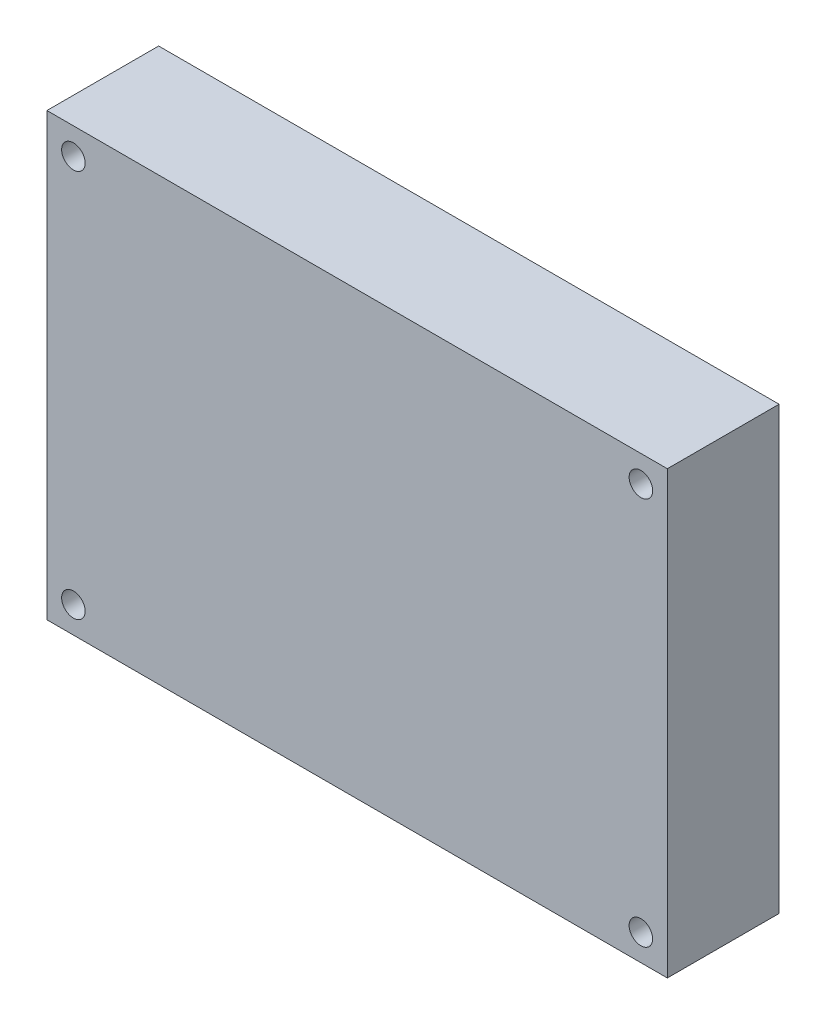
ISO-10303-21;
HEADER;
FILE_DESCRIPTION(('STEP AP214'),'2;1');
FILE_NAME('part.step','',(''),(''),'','','');
FILE_SCHEMA(('AUTOMOTIVE_DESIGN { 1 0 10303 214 1 1 1 1 }'));
ENDSEC;
DATA;
#1=APPLICATION_CONTEXT('core data for automotive mechanical design processes');
#2=APPLICATION_PROTOCOL_DEFINITION('international standard','automotive_design',2000,#1);
#3=PRODUCT_CONTEXT('',#1,'mechanical');
#4=PRODUCT('Part','Part','',(#3));
#5=PRODUCT_RELATED_PRODUCT_CATEGORY('part','',(#4));
#6=PRODUCT_DEFINITION_FORMATION('','',#4);
#7=PRODUCT_DEFINITION_CONTEXT('part definition',#1,'design');
#8=PRODUCT_DEFINITION('design','',#6,#7);
#9=PRODUCT_DEFINITION_SHAPE('','',#8);
#10=(LENGTH_UNIT() NAMED_UNIT(*) SI_UNIT(.MILLI.,.METRE.));
#11=(NAMED_UNIT(*) PLANE_ANGLE_UNIT() SI_UNIT($,.RADIAN.));
#12=(NAMED_UNIT(*) SI_UNIT($,.STERADIAN.) SOLID_ANGLE_UNIT());
#13=UNCERTAINTY_MEASURE_WITH_UNIT(LENGTH_MEASURE(1.E-05),#10,'distance_accuracy_value','');
#14=(GEOMETRIC_REPRESENTATION_CONTEXT(3) GLOBAL_UNCERTAINTY_ASSIGNED_CONTEXT((#13)) GLOBAL_UNIT_ASSIGNED_CONTEXT((#10,
#11,#12)) REPRESENTATION_CONTEXT('',''));
#15=CARTESIAN_POINT('',(0.,0.,0.));
#16=DIRECTION('',(0.,0.,1.));
#17=DIRECTION('',(1.,0.,0.));
#18=AXIS2_PLACEMENT_3D('',#15,#16,#17);
#19=CARTESIAN_POINT('',(52.75,-37.5,19.));
#20=DIRECTION('',(-1.,0.,0.));
#21=DIRECTION('',(0.,0.,1.));
#22=AXIS2_PLACEMENT_3D('',#19,#20,#21);
#23=PLANE('',#22);
#24=DIRECTION('',(0.,1.,0.));
#25=VECTOR('',#24,1.);
#26=CARTESIAN_POINT('',(52.75,-37.5,0.));
#27=LINE('',#26,#25);
#28=CARTESIAN_POINT('',(52.75,-37.5,0.));
#29=VERTEX_POINT('',#28);
#30=CARTESIAN_POINT('',(52.75,37.5,0.));
#31=VERTEX_POINT('',#30);
#32=EDGE_CURVE('E107',#29,#31,#27,.T.);
#33=ORIENTED_EDGE('',*,*,#32,.T.);
#34=DIRECTION('',(0.,0.,-1.));
#35=VECTOR('',#34,1.);
#36=CARTESIAN_POINT('',(52.75,37.5,19.));
#37=LINE('',#36,#35);
#38=CARTESIAN_POINT('',(52.75,37.5,19.));
#39=VERTEX_POINT('',#38);
#40=EDGE_CURVE('E11',#39,#31,#37,.T.);
#41=ORIENTED_EDGE('',*,*,#40,.F.);
#42=DIRECTION('',(0.,1.,0.));
#43=VECTOR('',#42,1.);
#44=CARTESIAN_POINT('',(52.75,-37.5,19.));
#45=LINE('',#44,#43);
#46=CARTESIAN_POINT('',(52.75,-37.5,19.));
#47=VERTEX_POINT('',#46);
#48=EDGE_CURVE('E91',#47,#39,#45,.T.);
#49=ORIENTED_EDGE('',*,*,#48,.F.);
#50=DIRECTION('',(0.,0.,-1.));
#51=VECTOR('',#50,1.);
#52=CARTESIAN_POINT('',(52.75,-37.5,19.));
#53=LINE('',#52,#51);
#54=EDGE_CURVE('E103',#47,#29,#53,.T.);
#55=ORIENTED_EDGE('',*,*,#54,.T.);
#56=EDGE_LOOP('',(#33,#41,#49,#55));
#57=FACE_BOUND('',#56,.T.);
#58=ADVANCED_FACE('F39',(#57),#23,.F.);
#59=CARTESIAN_POINT('',(-52.75,37.5,19.));
#60=DIRECTION('',(0.,-1.,0.));
#61=DIRECTION('',(0.,0.,-1.));
#62=AXIS2_PLACEMENT_3D('',#59,#60,#61);
#63=PLANE('',#62);
#64=DIRECTION('',(-1.,0.,0.));
#65=VECTOR('',#64,1.);
#66=CARTESIAN_POINT('',(-52.75,37.5,0.));
#67=LINE('',#66,#65);
#68=CARTESIAN_POINT('',(-52.75,37.5,0.));
#69=VERTEX_POINT('',#68);
#70=EDGE_CURVE('E96',#31,#69,#67,.T.);
#71=ORIENTED_EDGE('',*,*,#70,.T.);
#72=DIRECTION('',(0.,0.,-1.));
#73=VECTOR('',#72,1.);
#74=CARTESIAN_POINT('',(-52.75,37.5,19.));
#75=LINE('',#74,#73);
#76=CARTESIAN_POINT('',(-52.75,37.5,19.));
#77=VERTEX_POINT('',#76);
#78=EDGE_CURVE('E48',#77,#69,#75,.T.);
#79=ORIENTED_EDGE('',*,*,#78,.F.);
#80=DIRECTION('',(-1.,0.,0.));
#81=VECTOR('',#80,1.);
#82=CARTESIAN_POINT('',(-52.75,37.5,19.));
#83=LINE('',#82,#81);
#84=EDGE_CURVE('E86',#39,#77,#83,.T.);
#85=ORIENTED_EDGE('',*,*,#84,.F.);
#86=ORIENTED_EDGE('',*,*,#40,.T.);
#87=EDGE_LOOP('',(#71,#79,#85,#86));
#88=FACE_BOUND('',#87,.T.);
#89=ADVANCED_FACE('F95',(#88),#63,.F.);
#90=CARTESIAN_POINT('',(-52.75,-37.5,19.));
#91=DIRECTION('',(1.,0.,0.));
#92=DIRECTION('',(0.,0.,-1.));
#93=AXIS2_PLACEMENT_3D('',#90,#91,#92);
#94=PLANE('',#93);
#95=DIRECTION('',(0.,-1.,0.));
#96=VECTOR('',#95,1.);
#97=CARTESIAN_POINT('',(-52.75,-37.5,0.));
#98=LINE('',#97,#96);
#99=CARTESIAN_POINT('',(-52.75,-37.5,0.));
#100=VERTEX_POINT('',#99);
#101=EDGE_CURVE('E73',#69,#100,#98,.T.);
#102=ORIENTED_EDGE('',*,*,#101,.T.);
#103=DIRECTION('',(0.,0.,-1.));
#104=VECTOR('',#103,1.);
#105=CARTESIAN_POINT('',(-52.75,-37.5,19.));
#106=LINE('',#105,#104);
#107=CARTESIAN_POINT('',(-52.75,-37.5,19.));
#108=VERTEX_POINT('',#107);
#109=EDGE_CURVE('E98',#108,#100,#106,.T.);
#110=ORIENTED_EDGE('',*,*,#109,.F.);
#111=DIRECTION('',(0.,-1.,0.));
#112=VECTOR('',#111,1.);
#113=CARTESIAN_POINT('',(-52.75,-37.5,19.));
#114=LINE('',#113,#112);
#115=EDGE_CURVE('E89',#77,#108,#114,.T.);
#116=ORIENTED_EDGE('',*,*,#115,.F.);
#117=ORIENTED_EDGE('',*,*,#78,.T.);
#118=EDGE_LOOP('',(#102,#110,#116,#117));
#119=FACE_BOUND('',#118,.T.);
#120=ADVANCED_FACE('F99',(#119),#94,.F.);
#121=CARTESIAN_POINT('',(-52.75,-37.5,19.));
#122=DIRECTION('',(0.,1.,0.));
#123=DIRECTION('',(0.,0.,1.));
#124=AXIS2_PLACEMENT_3D('',#121,#122,#123);
#125=PLANE('',#124);
#126=DIRECTION('',(1.,0.,0.));
#127=VECTOR('',#126,1.);
#128=CARTESIAN_POINT('',(-52.75,-37.5,0.));
#129=LINE('',#128,#127);
#130=EDGE_CURVE('E79',#100,#29,#129,.T.);
#131=ORIENTED_EDGE('',*,*,#130,.T.);
#132=ORIENTED_EDGE('',*,*,#54,.F.);
#133=DIRECTION('',(1.,0.,0.));
#134=VECTOR('',#133,1.);
#135=CARTESIAN_POINT('',(-52.75,-37.5,19.));
#136=LINE('',#135,#134);
#137=EDGE_CURVE('E56',#108,#47,#136,.T.);
#138=ORIENTED_EDGE('',*,*,#137,.F.);
#139=ORIENTED_EDGE('',*,*,#109,.T.);
#140=EDGE_LOOP('',(#131,#132,#138,#139));
#141=FACE_BOUND('',#140,.T.);
#142=ADVANCED_FACE('F121',(#141),#125,.F.);
#143=CARTESIAN_POINT('',(0.,0.,19.));
#144=DIRECTION('',(0.,0.,-1.));
#145=DIRECTION('',(-1.,0.,0.));
#146=AXIS2_PLACEMENT_3D('',#143,#144,#145);
#147=PLANE('',#146);
#148=CARTESIAN_POINT('',(48.25,-33.,19.));
#149=DIRECTION('',(0.,0.,1.));
#150=DIRECTION('',(-1.,0.,0.));
#151=AXIS2_PLACEMENT_3D('',#148,#149,#150);
#152=CIRCLE('',#151,2.);
#153=CARTESIAN_POINT('',(46.25,-33.,19.));
#154=VERTEX_POINT('',#153);
#155=EDGE_CURVE('E152',#154,#154,#152,.T.);
#156=ORIENTED_EDGE('',*,*,#155,.F.);
#157=EDGE_LOOP('',(#156));
#158=FACE_BOUND('',#157,.T.);
#159=CARTESIAN_POINT('',(48.25,33.,19.));
#160=DIRECTION('',(0.,0.,-1.));
#161=DIRECTION('',(-1.,0.,0.));
#162=AXIS2_PLACEMENT_3D('',#159,#160,#161);
#163=CIRCLE('',#162,2.);
#164=CARTESIAN_POINT('',(46.25,33.,19.));
#165=VERTEX_POINT('',#164);
#166=EDGE_CURVE('E144',#165,#165,#163,.T.);
#167=ORIENTED_EDGE('',*,*,#166,.T.);
#168=EDGE_LOOP('',(#167));
#169=FACE_BOUND('',#168,.T.);
#170=CARTESIAN_POINT('',(-48.25,-33.,19.));
#171=DIRECTION('',(0.,0.,-1.));
#172=DIRECTION('',(1.,0.,0.));
#173=AXIS2_PLACEMENT_3D('',#170,#171,#172);
#174=CIRCLE('',#173,2.);
#175=CARTESIAN_POINT('',(-46.25,-33.,19.));
#176=VERTEX_POINT('',#175);
#177=EDGE_CURVE('E136',#176,#176,#174,.T.);
#178=ORIENTED_EDGE('',*,*,#177,.T.);
#179=EDGE_LOOP('',(#178));
#180=FACE_BOUND('',#179,.T.);
#181=CARTESIAN_POINT('',(-48.25,33.,19.));
#182=DIRECTION('',(0.,0.,1.));
#183=DIRECTION('',(1.,0.,0.));
#184=AXIS2_PLACEMENT_3D('',#181,#182,#183);
#185=CIRCLE('',#184,2.);
#186=CARTESIAN_POINT('',(-46.25,33.,19.));
#187=VERTEX_POINT('',#186);
#188=EDGE_CURVE('E128',#187,#187,#185,.T.);
#189=ORIENTED_EDGE('',*,*,#188,.F.);
#190=EDGE_LOOP('',(#189));
#191=FACE_BOUND('',#190,.T.);
#192=ORIENTED_EDGE('',*,*,#48,.T.);
#193=ORIENTED_EDGE('',*,*,#84,.T.);
#194=ORIENTED_EDGE('',*,*,#115,.T.);
#195=ORIENTED_EDGE('',*,*,#137,.T.);
#196=EDGE_LOOP('',(#192,#193,#194,#195));
#197=FACE_BOUND('',#196,.T.);
#198=ADVANCED_FACE('F87',(#158,#169,#180,#191,#197),#147,.F.);
#199=CARTESIAN_POINT('',(0.,0.,0.));
#200=DIRECTION('',(0.,0.,-1.));
#201=DIRECTION('',(-1.,0.,0.));
#202=AXIS2_PLACEMENT_3D('',#199,#200,#201);
#203=PLANE('',#202);
#204=CARTESIAN_POINT('',(48.25,-33.,0.));
#205=DIRECTION('',(0.,0.,1.));
#206=DIRECTION('',(-1.,0.,0.));
#207=AXIS2_PLACEMENT_3D('',#204,#205,#206);
#208=CIRCLE('',#207,2.);
#209=CARTESIAN_POINT('',(46.25,-33.,0.));
#210=VERTEX_POINT('',#209);
#211=EDGE_CURVE('E148',#210,#210,#208,.T.);
#212=ORIENTED_EDGE('',*,*,#211,.T.);
#213=EDGE_LOOP('',(#212));
#214=FACE_BOUND('',#213,.T.);
#215=CARTESIAN_POINT('',(48.25,33.,0.));
#216=DIRECTION('',(0.,0.,-1.));
#217=DIRECTION('',(-1.,0.,0.));
#218=AXIS2_PLACEMENT_3D('',#215,#216,#217);
#219=CIRCLE('',#218,2.);
#220=CARTESIAN_POINT('',(46.25,33.,0.));
#221=VERTEX_POINT('',#220);
#222=EDGE_CURVE('E140',#221,#221,#219,.T.);
#223=ORIENTED_EDGE('',*,*,#222,.F.);
#224=EDGE_LOOP('',(#223));
#225=FACE_BOUND('',#224,.T.);
#226=CARTESIAN_POINT('',(-48.25,-33.,0.));
#227=DIRECTION('',(0.,0.,-1.));
#228=DIRECTION('',(1.,0.,0.));
#229=AXIS2_PLACEMENT_3D('',#226,#227,#228);
#230=CIRCLE('',#229,2.);
#231=CARTESIAN_POINT('',(-46.25,-33.,0.));
#232=VERTEX_POINT('',#231);
#233=EDGE_CURVE('E132',#232,#232,#230,.T.);
#234=ORIENTED_EDGE('',*,*,#233,.F.);
#235=EDGE_LOOP('',(#234));
#236=FACE_BOUND('',#235,.T.);
#237=CARTESIAN_POINT('',(-48.25,33.,0.));
#238=DIRECTION('',(0.,0.,1.));
#239=DIRECTION('',(1.,0.,0.));
#240=AXIS2_PLACEMENT_3D('',#237,#238,#239);
#241=CIRCLE('',#240,2.);
#242=CARTESIAN_POINT('',(-46.25,33.,0.));
#243=VERTEX_POINT('',#242);
#244=EDGE_CURVE('E111',#243,#243,#241,.T.);
#245=ORIENTED_EDGE('',*,*,#244,.T.);
#246=EDGE_LOOP('',(#245));
#247=FACE_BOUND('',#246,.T.);
#248=ORIENTED_EDGE('',*,*,#32,.F.);
#249=ORIENTED_EDGE('',*,*,#130,.F.);
#250=ORIENTED_EDGE('',*,*,#101,.F.);
#251=ORIENTED_EDGE('',*,*,#70,.F.);
#252=EDGE_LOOP('',(#248,#249,#250,#251));
#253=FACE_BOUND('',#252,.T.);
#254=ADVANCED_FACE('F124',(#214,#225,#236,#247,#253),#203,.T.);
#255=CARTESIAN_POINT('',(-48.25,33.,0.));
#256=DIRECTION('',(0.,0.,1.));
#257=DIRECTION('',(1.,0.,0.));
#258=AXIS2_PLACEMENT_3D('',#255,#256,#257);
#259=CYLINDRICAL_SURFACE('',#258,2.);
#260=ORIENTED_EDGE('',*,*,#244,.F.);
#261=EDGE_LOOP('',(#260));
#262=FACE_BOUND('',#261,.T.);
#263=ORIENTED_EDGE('',*,*,#188,.T.);
#264=EDGE_LOOP('',(#263));
#265=FACE_BOUND('',#264,.T.);
#266=ADVANCED_FACE('F178',(#262,#265),#259,.F.);
#267=CARTESIAN_POINT('',(-48.25,-33.,0.));
#268=DIRECTION('',(0.,0.,1.));
#269=DIRECTION('',(1.,0.,0.));
#270=AXIS2_PLACEMENT_3D('',#267,#268,#269);
#271=CYLINDRICAL_SURFACE('',#270,2.);
#272=ORIENTED_EDGE('',*,*,#233,.T.);
#273=EDGE_LOOP('',(#272));
#274=FACE_BOUND('',#273,.T.);
#275=ORIENTED_EDGE('',*,*,#177,.F.);
#276=EDGE_LOOP('',(#275));
#277=FACE_BOUND('',#276,.T.);
#278=ADVANCED_FACE('F180',(#274,#277),#271,.F.);
#279=CARTESIAN_POINT('',(48.25,33.,0.));
#280=DIRECTION('',(0.,0.,1.));
#281=DIRECTION('',(1.,0.,0.));
#282=AXIS2_PLACEMENT_3D('',#279,#280,#281);
#283=CYLINDRICAL_SURFACE('',#282,2.);
#284=ORIENTED_EDGE('',*,*,#222,.T.);
#285=EDGE_LOOP('',(#284));
#286=FACE_BOUND('',#285,.T.);
#287=ORIENTED_EDGE('',*,*,#166,.F.);
#288=EDGE_LOOP('',(#287));
#289=FACE_BOUND('',#288,.T.);
#290=ADVANCED_FACE('F165',(#286,#289),#283,.F.);
#291=CARTESIAN_POINT('',(48.25,-33.,0.));
#292=DIRECTION('',(0.,0.,1.));
#293=DIRECTION('',(1.,0.,0.));
#294=AXIS2_PLACEMENT_3D('',#291,#292,#293);
#295=CYLINDRICAL_SURFACE('',#294,2.);
#296=ORIENTED_EDGE('',*,*,#211,.F.);
#297=EDGE_LOOP('',(#296));
#298=FACE_BOUND('',#297,.T.);
#299=ORIENTED_EDGE('',*,*,#155,.T.);
#300=EDGE_LOOP('',(#299));
#301=FACE_BOUND('',#300,.T.);
#302=ADVANCED_FACE('F162',(#298,#301),#295,.F.);
#303=CLOSED_SHELL('',(#58,#89,#120,#142,#198,#254,#266,#278,#290,#302));
#304=MANIFOLD_SOLID_BREP('B2',#303);
#305=ADVANCED_BREP_SHAPE_REPRESENTATION('',(#18,#304),#14);
#306=SHAPE_DEFINITION_REPRESENTATION(#9,#305);
ENDSEC;
END-ISO-10303-21;
